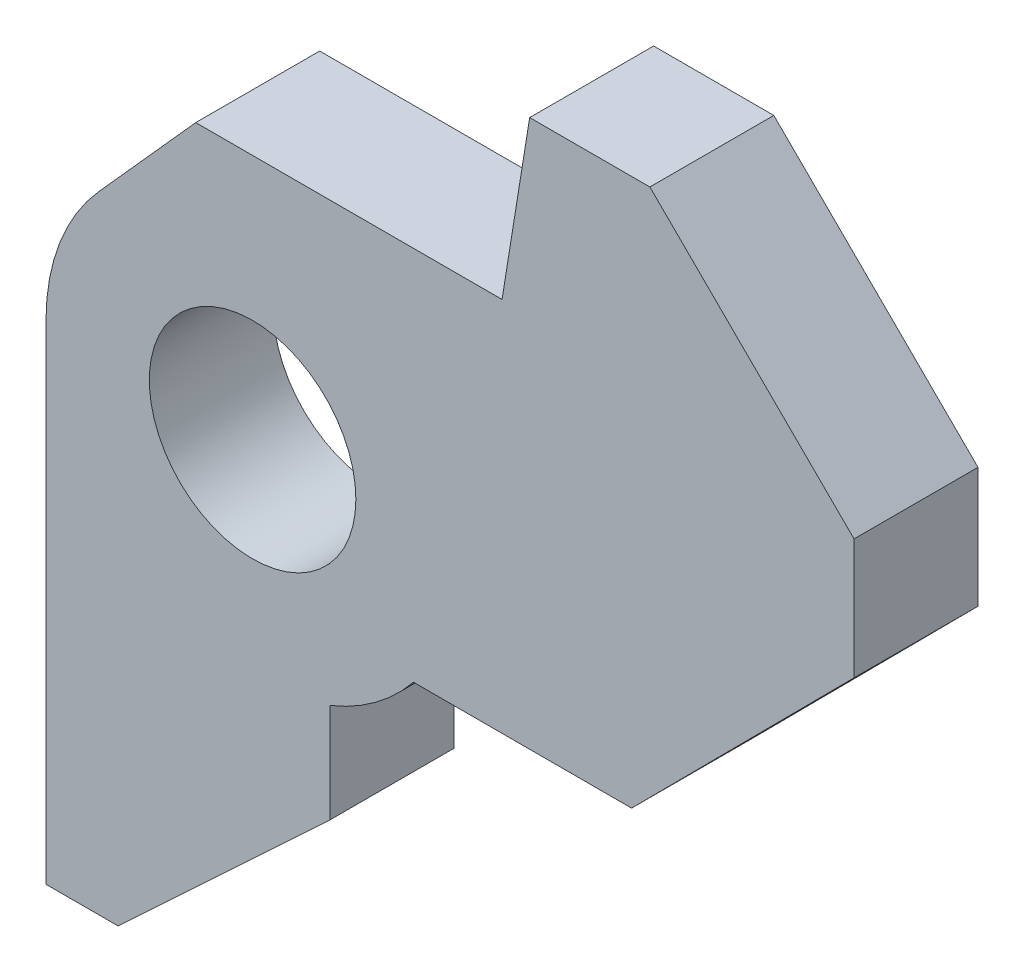
ISO-10303-21;
HEADER;
FILE_DESCRIPTION(('STEP AP214'),'2;1');
FILE_NAME('part.step','',(''),(''),'','','');
FILE_SCHEMA(('AUTOMOTIVE_DESIGN { 1 0 10303 214 1 1 1 1 }'));
ENDSEC;
DATA;
#1=APPLICATION_CONTEXT('core data for automotive mechanical design processes');
#2=APPLICATION_PROTOCOL_DEFINITION('international standard','automotive_design',2000,#1);
#3=PRODUCT_CONTEXT('',#1,'mechanical');
#4=PRODUCT('Part','Part','',(#3));
#5=PRODUCT_RELATED_PRODUCT_CATEGORY('part','',(#4));
#6=PRODUCT_DEFINITION_FORMATION('','',#4);
#7=PRODUCT_DEFINITION_CONTEXT('part definition',#1,'design');
#8=PRODUCT_DEFINITION('design','',#6,#7);
#9=PRODUCT_DEFINITION_SHAPE('','',#8);
#10=(LENGTH_UNIT() NAMED_UNIT(*) SI_UNIT(.MILLI.,.METRE.));
#11=(NAMED_UNIT(*) PLANE_ANGLE_UNIT() SI_UNIT($,.RADIAN.));
#12=(NAMED_UNIT(*) SI_UNIT($,.STERADIAN.) SOLID_ANGLE_UNIT());
#13=UNCERTAINTY_MEASURE_WITH_UNIT(LENGTH_MEASURE(1.E-05),#10,'distance_accuracy_value','');
#14=(GEOMETRIC_REPRESENTATION_CONTEXT(3) GLOBAL_UNCERTAINTY_ASSIGNED_CONTEXT((#13)) GLOBAL_UNIT_ASSIGNED_CONTEXT((#10,
#11,#12)) REPRESENTATION_CONTEXT('',''));
#15=CARTESIAN_POINT('',(0.,0.,0.));
#16=DIRECTION('',(0.,0.,1.));
#17=DIRECTION('',(1.,0.,0.));
#18=AXIS2_PLACEMENT_3D('',#15,#16,#17);
#19=CARTESIAN_POINT('',(-3.72439251199893,3.33600066195531,3.));
#20=DIRECTION('',(0.744878502399786,-0.667200132391063,0.));
#21=DIRECTION('',(0.667200132391063,0.744878502399786,0.));
#22=AXIS2_PLACEMENT_3D('',#19,#20,#21);
#23=PLANE('',#22);
#24=DIRECTION('',(-0.667200132391063,-0.744878502399786,0.));
#25=VECTOR('',#24,1.);
#26=CARTESIAN_POINT('',(-3.72439251199893,3.33600066195531,0.));
#27=LINE('',#26,#25);
#28=CARTESIAN_POINT('',(-1.37635566788677,5.95740626892641,0.));
#29=VERTEX_POINT('',#28);
#30=CARTESIAN_POINT('',(-3.72439251199893,3.33600066195531,0.));
#31=VERTEX_POINT('',#30);
#32=EDGE_CURVE('E170',#29,#31,#27,.T.);
#33=ORIENTED_EDGE('',*,*,#32,.T.);
#34=DIRECTION('',(0.,0.,-1.));
#35=VECTOR('',#34,1.);
#36=CARTESIAN_POINT('',(-3.72439251199893,3.33600066195531,3.));
#37=LINE('',#36,#35);
#38=CARTESIAN_POINT('',(-3.72439251199893,3.33600066195531,3.));
#39=VERTEX_POINT('',#38);
#40=EDGE_CURVE('E11',#39,#31,#37,.T.);
#41=ORIENTED_EDGE('',*,*,#40,.F.);
#42=DIRECTION('',(-0.667200132391063,-0.744878502399786,0.));
#43=VECTOR('',#42,1.);
#44=CARTESIAN_POINT('',(-3.72439251199893,3.33600066195531,3.));
#45=LINE('',#44,#43);
#46=CARTESIAN_POINT('',(-1.37635566788677,5.95740626892641,3.));
#47=VERTEX_POINT('',#46);
#48=EDGE_CURVE('E208',#47,#39,#45,.T.);
#49=ORIENTED_EDGE('',*,*,#48,.F.);
#50=DIRECTION('',(0.,0.,-1.));
#51=VECTOR('',#50,1.);
#52=CARTESIAN_POINT('',(-1.37635566788677,5.95740626892641,3.));
#53=LINE('',#52,#51);
#54=EDGE_CURVE('E169',#47,#29,#53,.T.);
#55=ORIENTED_EDGE('',*,*,#54,.T.);
#56=EDGE_LOOP('',(#33,#41,#49,#55));
#57=FACE_BOUND('',#56,.T.);
#58=ADVANCED_FACE('F35',(#57),#23,.F.);
#59=CARTESIAN_POINT('',(0.,0.,3.));
#60=DIRECTION('',(0.,0.,-1.));
#61=DIRECTION('',(-1.,0.,0.));
#62=AXIS2_PLACEMENT_3D('',#59,#60,#61);
#63=CYLINDRICAL_SURFACE('',#62,5.);
#64=CARTESIAN_POINT('',(0.,0.,0.));
#65=DIRECTION('',(0.,0.,1.));
#66=DIRECTION('',(1.,0.,0.));
#67=AXIS2_PLACEMENT_3D('',#64,#65,#66);
#68=CIRCLE('',#67,5.);
#69=CARTESIAN_POINT('',(-5.,0.,0.));
#70=VERTEX_POINT('',#69);
#71=EDGE_CURVE('E173',#31,#70,#68,.T.);
#72=ORIENTED_EDGE('',*,*,#71,.T.);
#73=DIRECTION('',(0.,0.,-1.));
#74=VECTOR('',#73,1.);
#75=CARTESIAN_POINT('',(-5.,0.,3.));
#76=LINE('',#75,#74);
#77=CARTESIAN_POINT('',(-5.,0.,3.));
#78=VERTEX_POINT('',#77);
#79=EDGE_CURVE('E43',#78,#70,#76,.T.);
#80=ORIENTED_EDGE('',*,*,#79,.F.);
#81=CARTESIAN_POINT('',(0.,0.,3.));
#82=DIRECTION('',(0.,0.,1.));
#83=DIRECTION('',(1.,0.,0.));
#84=AXIS2_PLACEMENT_3D('',#81,#82,#83);
#85=CIRCLE('',#84,5.);
#86=EDGE_CURVE('E108',#39,#78,#85,.T.);
#87=ORIENTED_EDGE('',*,*,#86,.F.);
#88=ORIENTED_EDGE('',*,*,#40,.T.);
#89=EDGE_LOOP('',(#72,#80,#87,#88));
#90=FACE_BOUND('',#89,.T.);
#91=ADVANCED_FACE('F233',(#90),#63,.T.);
#92=CARTESIAN_POINT('',(-5.,0.,3.));
#93=DIRECTION('',(-1.,0.,0.));
#94=DIRECTION('',(0.,-1.,0.));
#95=AXIS2_PLACEMENT_3D('',#92,#93,#94);
#96=PLANE('',#95);
#97=DIRECTION('',(0.,1.,0.));
#98=VECTOR('',#97,1.);
#99=CARTESIAN_POINT('',(-5.,0.,0.));
#100=LINE('',#99,#98);
#101=CARTESIAN_POINT('',(-5.,-11.8208712627164,0.));
#102=VERTEX_POINT('',#101);
#103=EDGE_CURVE('E176',#102,#70,#100,.T.);
#104=ORIENTED_EDGE('',*,*,#103,.F.);
#105=DIRECTION('',(0.,0.,-1.));
#106=VECTOR('',#105,1.);
#107=CARTESIAN_POINT('',(-5.,-11.8208712627164,3.));
#108=LINE('',#107,#106);
#109=CARTESIAN_POINT('',(-5.,-11.8208712627164,3.));
#110=VERTEX_POINT('',#109);
#111=EDGE_CURVE('E226',#110,#102,#108,.T.);
#112=ORIENTED_EDGE('',*,*,#111,.F.);
#113=DIRECTION('',(0.,1.,0.));
#114=VECTOR('',#113,1.);
#115=CARTESIAN_POINT('',(-5.,0.,3.));
#116=LINE('',#115,#114);
#117=EDGE_CURVE('E232',#110,#78,#116,.T.);
#118=ORIENTED_EDGE('',*,*,#117,.T.);
#119=ORIENTED_EDGE('',*,*,#79,.T.);
#120=EDGE_LOOP('',(#104,#112,#118,#119));
#121=FACE_BOUND('',#120,.T.);
#122=ADVANCED_FACE('F230',(#121),#96,.T.);
#123=CARTESIAN_POINT('',(0.,-11.8208712627164,3.));
#124=DIRECTION('',(0.,-1.,0.));
#125=DIRECTION('',(0.,0.,-1.));
#126=AXIS2_PLACEMENT_3D('',#123,#124,#125);
#127=PLANE('',#126);
#128=DIRECTION('',(-1.,0.,0.));
#129=VECTOR('',#128,1.);
#130=CARTESIAN_POINT('',(0.,-11.8208712627164,0.));
#131=LINE('',#130,#129);
#132=CARTESIAN_POINT('',(-3.25347983881159,-11.8208712627164,0.));
#133=VERTEX_POINT('',#132);
#134=EDGE_CURVE('E180',#133,#102,#131,.T.);
#135=ORIENTED_EDGE('',*,*,#134,.F.);
#136=DIRECTION('',(0.,0.,-1.));
#137=VECTOR('',#136,1.);
#138=CARTESIAN_POINT('',(-3.25347983881159,-11.8208712627164,3.));
#139=LINE('',#138,#137);
#140=CARTESIAN_POINT('',(-3.25347983881159,-11.8208712627164,3.));
#141=VERTEX_POINT('',#140);
#142=EDGE_CURVE('E224',#141,#133,#139,.T.);
#143=ORIENTED_EDGE('',*,*,#142,.F.);
#144=DIRECTION('',(-1.,0.,0.));
#145=VECTOR('',#144,1.);
#146=CARTESIAN_POINT('',(0.,-11.8208712627164,3.));
#147=LINE('',#146,#145);
#148=EDGE_CURVE('E246',#141,#110,#147,.T.);
#149=ORIENTED_EDGE('',*,*,#148,.T.);
#150=ORIENTED_EDGE('',*,*,#111,.T.);
#151=EDGE_LOOP('',(#135,#143,#149,#150));
#152=FACE_BOUND('',#151,.T.);
#153=ADVANCED_FACE('F242',(#152),#127,.T.);
#154=CARTESIAN_POINT('',(4.38123273818553,-4.69232370569134,3.));
#155=DIRECTION('',(-0.682462310143159,0.730920785881796,0.));
#156=DIRECTION('',(-0.730920785881796,-0.682462310143159,0.));
#157=AXIS2_PLACEMENT_3D('',#154,#155,#156);
#158=PLANE('',#157);
#159=DIRECTION('',(0.730920785881796,0.682462310143159,0.));
#160=VECTOR('',#159,1.);
#161=CARTESIAN_POINT('',(4.38123273818553,-4.69232370569134,0.));
#162=LINE('',#161,#160);
#163=CARTESIAN_POINT('',(1.87605445969652,-7.03141405348529,0.));
#164=VERTEX_POINT('',#163);
#165=EDGE_CURVE('E183',#133,#164,#162,.T.);
#166=ORIENTED_EDGE('',*,*,#165,.T.);
#167=DIRECTION('',(0.,0.,-1.));
#168=VECTOR('',#167,1.);
#169=CARTESIAN_POINT('',(1.87605445969652,-7.03141405348529,3.));
#170=LINE('',#169,#168);
#171=CARTESIAN_POINT('',(1.87605445969652,-7.03141405348529,3.));
#172=VERTEX_POINT('',#171);
#173=EDGE_CURVE('E222',#172,#164,#170,.T.);
#174=ORIENTED_EDGE('',*,*,#173,.F.);
#175=DIRECTION('',(0.730920785881796,0.682462310143159,0.));
#176=VECTOR('',#175,1.);
#177=CARTESIAN_POINT('',(4.38123273818553,-4.69232370569134,3.));
#178=LINE('',#177,#176);
#179=EDGE_CURVE('E248',#141,#172,#178,.T.);
#180=ORIENTED_EDGE('',*,*,#179,.F.);
#181=ORIENTED_EDGE('',*,*,#142,.T.);
#182=EDGE_LOOP('',(#166,#174,#180,#181));
#183=FACE_BOUND('',#182,.T.);
#184=ADVANCED_FACE('F304',(#183),#158,.F.);
#185=CARTESIAN_POINT('',(1.87605445969652,0.,3.));
#186=DIRECTION('',(1.,0.,0.));
#187=DIRECTION('',(0.,0.,-1.));
#188=AXIS2_PLACEMENT_3D('',#185,#186,#187);
#189=PLANE('',#188);
#190=DIRECTION('',(0.,-1.,0.));
#191=VECTOR('',#190,1.);
#192=CARTESIAN_POINT('',(1.87605445969652,0.,0.));
#193=LINE('',#192,#191);
#194=CARTESIAN_POINT('',(1.87605445969652,-4.63469736490451,0.));
#195=VERTEX_POINT('',#194);
#196=EDGE_CURVE('E186',#195,#164,#193,.T.);
#197=ORIENTED_EDGE('',*,*,#196,.F.);
#198=DIRECTION('',(0.,0.,-1.));
#199=VECTOR('',#198,1.);
#200=CARTESIAN_POINT('',(1.87605445969652,-4.63469736490451,3.));
#201=LINE('',#200,#199);
#202=CARTESIAN_POINT('',(1.87605445969652,-4.63469736490451,3.));
#203=VERTEX_POINT('',#202);
#204=EDGE_CURVE('E220',#203,#195,#201,.T.);
#205=ORIENTED_EDGE('',*,*,#204,.F.);
#206=DIRECTION('',(0.,-1.,0.));
#207=VECTOR('',#206,1.);
#208=CARTESIAN_POINT('',(1.87605445969652,0.,3.));
#209=LINE('',#208,#207);
#210=EDGE_CURVE('E255',#203,#172,#209,.T.);
#211=ORIENTED_EDGE('',*,*,#210,.T.);
#212=ORIENTED_EDGE('',*,*,#173,.T.);
#213=EDGE_LOOP('',(#197,#205,#211,#212));
#214=FACE_BOUND('',#213,.T.);
#215=ADVANCED_FACE('F296',(#214),#189,.T.);
#216=CARTESIAN_POINT('',(3.8931956076666,-3.13736003041498,0.));
#217=VERTEX_POINT('',#216);
#218=EDGE_CURVE('E177',#195,#217,#68,.T.);
#219=ORIENTED_EDGE('',*,*,#218,.T.);
#220=DIRECTION('',(0.,0.,-1.));
#221=VECTOR('',#220,1.);
#222=CARTESIAN_POINT('',(3.8931956076666,-3.13736003041498,3.));
#223=LINE('',#222,#221);
#224=CARTESIAN_POINT('',(3.8931956076666,-3.13736003041498,3.));
#225=VERTEX_POINT('',#224);
#226=EDGE_CURVE('E218',#225,#217,#223,.T.);
#227=ORIENTED_EDGE('',*,*,#226,.F.);
#228=EDGE_CURVE('E251',#203,#225,#85,.T.);
#229=ORIENTED_EDGE('',*,*,#228,.F.);
#230=ORIENTED_EDGE('',*,*,#204,.T.);
#231=EDGE_LOOP('',(#219,#227,#229,#230));
#232=FACE_BOUND('',#231,.T.);
#233=ADVANCED_FACE('F288',(#232),#63,.T.);
#234=CARTESIAN_POINT('',(0.,-3.13736003041498,3.));
#235=DIRECTION('',(0.,-1.,0.));
#236=DIRECTION('',(1.,0.,0.));
#237=AXIS2_PLACEMENT_3D('',#234,#235,#236);
#238=PLANE('',#237);
#239=DIRECTION('',(-1.,0.,0.));
#240=VECTOR('',#239,1.);
#241=CARTESIAN_POINT('',(0.,-3.13736003041498,0.));
#242=LINE('',#241,#240);
#243=CARTESIAN_POINT('',(9.17297865889068,-3.13736003041498,0.));
#244=VERTEX_POINT('',#243);
#245=EDGE_CURVE('E189',#244,#217,#242,.T.);
#246=ORIENTED_EDGE('',*,*,#245,.F.);
#247=DIRECTION('',(0.,0.,-1.));
#248=VECTOR('',#247,1.);
#249=CARTESIAN_POINT('',(9.17297865889068,-3.13736003041498,3.));
#250=LINE('',#249,#248);
#251=CARTESIAN_POINT('',(9.17297865889068,-3.13736003041498,3.));
#252=VERTEX_POINT('',#251);
#253=EDGE_CURVE('E216',#252,#244,#250,.T.);
#254=ORIENTED_EDGE('',*,*,#253,.F.);
#255=DIRECTION('',(-1.,0.,0.));
#256=VECTOR('',#255,1.);
#257=CARTESIAN_POINT('',(0.,-3.13736003041498,3.));
#258=LINE('',#257,#256);
#259=EDGE_CURVE('E258',#252,#225,#258,.T.);
#260=ORIENTED_EDGE('',*,*,#259,.T.);
#261=ORIENTED_EDGE('',*,*,#226,.T.);
#262=EDGE_LOOP('',(#246,#254,#260,#261));
#263=FACE_BOUND('',#262,.T.);
#264=ADVANCED_FACE('F295',(#263),#238,.T.);
#265=CARTESIAN_POINT('',(6.18871742745594,-6.14355777107952,3.));
#266=DIRECTION('',(0.709691382805681,-0.704512697665102,0.));
#267=DIRECTION('',(0.704512697665102,0.709691382805681,0.));
#268=AXIS2_PLACEMENT_3D('',#265,#266,#267);
#269=PLANE('',#268);
#270=DIRECTION('',(-0.704512697665102,-0.709691382805682,0.));
#271=VECTOR('',#270,1.);
#272=CARTESIAN_POINT('',(6.18871742745594,-6.14355777107952,0.));
#273=LINE('',#272,#271);
#274=CARTESIAN_POINT('',(14.557074242056,2.28631260492328,0.));
#275=VERTEX_POINT('',#274);
#276=EDGE_CURVE('E192',#275,#244,#273,.T.);
#277=ORIENTED_EDGE('',*,*,#276,.F.);
#278=DIRECTION('',(0.,0.,-1.));
#279=VECTOR('',#278,1.);
#280=CARTESIAN_POINT('',(14.557074242056,2.28631260492328,3.));
#281=LINE('',#280,#279);
#282=CARTESIAN_POINT('',(14.557074242056,2.28631260492328,3.));
#283=VERTEX_POINT('',#282);
#284=EDGE_CURVE('E214',#283,#275,#281,.T.);
#285=ORIENTED_EDGE('',*,*,#284,.F.);
#286=DIRECTION('',(-0.704512697665102,-0.709691382805682,0.));
#287=VECTOR('',#286,1.);
#288=CARTESIAN_POINT('',(6.18871742745594,-6.14355777107952,3.));
#289=LINE('',#288,#287);
#290=EDGE_CURVE('E261',#283,#252,#289,.T.);
#291=ORIENTED_EDGE('',*,*,#290,.T.);
#292=ORIENTED_EDGE('',*,*,#253,.T.);
#293=EDGE_LOOP('',(#277,#285,#291,#292));
#294=FACE_BOUND('',#293,.T.);
#295=ADVANCED_FACE('F302',(#294),#269,.T.);
#296=CARTESIAN_POINT('',(14.557074242056,0.,3.));
#297=DIRECTION('',(1.,0.,0.));
#298=DIRECTION('',(0.,0.,-1.));
#299=AXIS2_PLACEMENT_3D('',#296,#297,#298);
#300=PLANE('',#299);
#301=DIRECTION('',(0.,-1.,0.));
#302=VECTOR('',#301,1.);
#303=CARTESIAN_POINT('',(14.557074242056,0.,0.));
#304=LINE('',#303,#302);
#305=CARTESIAN_POINT('',(14.557074242056,5.19802237614641,0.));
#306=VERTEX_POINT('',#305);
#307=EDGE_CURVE('E195',#306,#275,#304,.T.);
#308=ORIENTED_EDGE('',*,*,#307,.F.);
#309=DIRECTION('',(0.,0.,-1.));
#310=VECTOR('',#309,1.);
#311=CARTESIAN_POINT('',(14.557074242056,5.19802237614641,3.));
#312=LINE('',#311,#310);
#313=CARTESIAN_POINT('',(14.557074242056,5.19802237614641,3.));
#314=VERTEX_POINT('',#313);
#315=EDGE_CURVE('E212',#314,#306,#312,.T.);
#316=ORIENTED_EDGE('',*,*,#315,.F.);
#317=DIRECTION('',(0.,-1.,0.));
#318=VECTOR('',#317,1.);
#319=CARTESIAN_POINT('',(14.557074242056,0.,3.));
#320=LINE('',#319,#318);
#321=EDGE_CURVE('E264',#314,#283,#320,.T.);
#322=ORIENTED_EDGE('',*,*,#321,.T.);
#323=ORIENTED_EDGE('',*,*,#284,.T.);
#324=EDGE_LOOP('',(#308,#316,#322,#323));
#325=FACE_BOUND('',#324,.T.);
#326=ADVANCED_FACE('F318',(#325),#300,.T.);
#327=CARTESIAN_POINT('',(9.82417265596004,9.89638753174656,3.));
#328=DIRECTION('',(0.704512697665102,0.709691382805682,0.));
#329=DIRECTION('',(-0.709691382805682,0.704512697665102,0.));
#330=AXIS2_PLACEMENT_3D('',#327,#328,#329);
#331=PLANE('',#330);
#332=DIRECTION('',(0.709691382805682,-0.704512697665102,0.));
#333=VECTOR('',#332,1.);
#334=CARTESIAN_POINT('',(9.82417265596004,9.89638753174656,0.));
#335=LINE('',#334,#333);
#336=CARTESIAN_POINT('',(9.61535339808183,10.1036830157506,0.));
#337=VERTEX_POINT('',#336);
#338=EDGE_CURVE('E198',#337,#306,#335,.T.);
#339=ORIENTED_EDGE('',*,*,#338,.F.);
#340=DIRECTION('',(0.,0.,-1.));
#341=VECTOR('',#340,1.);
#342=CARTESIAN_POINT('',(9.61535339808183,10.1036830157506,3.));
#343=LINE('',#342,#341);
#344=CARTESIAN_POINT('',(9.61535339808183,10.1036830157506,3.));
#345=VERTEX_POINT('',#344);
#346=EDGE_CURVE('E151',#345,#337,#343,.T.);
#347=ORIENTED_EDGE('',*,*,#346,.F.);
#348=DIRECTION('',(0.709691382805682,-0.704512697665102,0.));
#349=VECTOR('',#348,1.);
#350=CARTESIAN_POINT('',(9.82417265596004,9.89638753174656,3.));
#351=LINE('',#350,#349);
#352=EDGE_CURVE('E159',#345,#314,#351,.T.);
#353=ORIENTED_EDGE('',*,*,#352,.T.);
#354=ORIENTED_EDGE('',*,*,#315,.T.);
#355=EDGE_LOOP('',(#339,#347,#353,#354));
#356=FACE_BOUND('',#355,.T.);
#357=ADVANCED_FACE('F268',(#356),#331,.T.);
#358=CARTESIAN_POINT('',(0.,10.1036830157506,3.));
#359=DIRECTION('',(0.,1.,0.));
#360=DIRECTION('',(0.,0.,1.));
#361=AXIS2_PLACEMENT_3D('',#358,#359,#360);
#362=PLANE('',#361);
#363=DIRECTION('',(1.,0.,0.));
#364=VECTOR('',#363,1.);
#365=CARTESIAN_POINT('',(0.,10.1036830157506,0.));
#366=LINE('',#365,#364);
#367=CARTESIAN_POINT('',(6.70626849442613,10.1036830157506,0.));
#368=VERTEX_POINT('',#367);
#369=EDGE_CURVE('E146',#368,#337,#366,.T.);
#370=ORIENTED_EDGE('',*,*,#369,.F.);
#371=DIRECTION('',(0.,0.,-1.));
#372=VECTOR('',#371,1.);
#373=CARTESIAN_POINT('',(6.70626849442613,10.1036830157506,3.));
#374=LINE('',#373,#372);
#375=CARTESIAN_POINT('',(6.70626849442613,10.1036830157506,3.));
#376=VERTEX_POINT('',#375);
#377=EDGE_CURVE('E141',#376,#368,#374,.T.);
#378=ORIENTED_EDGE('',*,*,#377,.F.);
#379=DIRECTION('',(1.,0.,0.));
#380=VECTOR('',#379,1.);
#381=CARTESIAN_POINT('',(0.,10.1036830157506,3.));
#382=LINE('',#381,#380);
#383=EDGE_CURVE('E144',#376,#345,#382,.T.);
#384=ORIENTED_EDGE('',*,*,#383,.T.);
#385=ORIENTED_EDGE('',*,*,#346,.T.);
#386=EDGE_LOOP('',(#370,#378,#384,#385));
#387=FACE_BOUND('',#386,.T.);
#388=ADVANCED_FACE('F143',(#387),#362,.T.);
#389=CARTESIAN_POINT('',(4.94893615583577,-0.797776271857066,3.));
#390=DIRECTION('',(-0.987254891374429,0.159147037224273,0.));
#391=DIRECTION('',(-0.159147037224273,-0.987254891374429,0.));
#392=AXIS2_PLACEMENT_3D('',#389,#390,#391);
#393=PLANE('',#392);
#394=DIRECTION('',(0.159147037224273,0.987254891374429,0.));
#395=VECTOR('',#394,1.);
#396=CARTESIAN_POINT('',(4.94893615583577,-0.797776271857066,0.));
#397=LINE('',#396,#395);
#398=CARTESIAN_POINT('',(6.03788217845628,5.95740626892641,0.));
#399=VERTEX_POINT('',#398);
#400=EDGE_CURVE('E202',#399,#368,#397,.T.);
#401=ORIENTED_EDGE('',*,*,#400,.F.);
#402=DIRECTION('',(0.,0.,-1.));
#403=VECTOR('',#402,1.);
#404=CARTESIAN_POINT('',(6.03788217845628,5.95740626892641,3.));
#405=LINE('',#404,#403);
#406=CARTESIAN_POINT('',(6.03788217845628,5.95740626892641,3.));
#407=VERTEX_POINT('',#406);
#408=EDGE_CURVE('E97',#407,#399,#405,.T.);
#409=ORIENTED_EDGE('',*,*,#408,.F.);
#410=DIRECTION('',(0.159147037224273,0.987254891374429,0.));
#411=VECTOR('',#410,1.);
#412=CARTESIAN_POINT('',(4.94893615583577,-0.797776271857066,3.));
#413=LINE('',#412,#411);
#414=EDGE_CURVE('E156',#407,#376,#413,.T.);
#415=ORIENTED_EDGE('',*,*,#414,.T.);
#416=ORIENTED_EDGE('',*,*,#377,.T.);
#417=EDGE_LOOP('',(#401,#409,#415,#416));
#418=FACE_BOUND('',#417,.T.);
#419=ADVANCED_FACE('F161',(#418),#393,.T.);
#420=CARTESIAN_POINT('',(0.,5.95740626892641,3.));
#421=DIRECTION('',(0.,-1.,0.));
#422=DIRECTION('',(1.,0.,0.));
#423=AXIS2_PLACEMENT_3D('',#420,#421,#422);
#424=PLANE('',#423);
#425=DIRECTION('',(-1.,0.,0.));
#426=VECTOR('',#425,1.);
#427=CARTESIAN_POINT('',(0.,5.95740626892641,0.));
#428=LINE('',#427,#426);
#429=EDGE_CURVE('E100',#399,#29,#428,.T.);
#430=ORIENTED_EDGE('',*,*,#429,.T.);
#431=ORIENTED_EDGE('',*,*,#54,.F.);
#432=DIRECTION('',(-1.,0.,0.));
#433=VECTOR('',#432,1.);
#434=CARTESIAN_POINT('',(0.,5.95740626892641,3.));
#435=LINE('',#434,#433);
#436=EDGE_CURVE('E51',#407,#47,#435,.T.);
#437=ORIENTED_EDGE('',*,*,#436,.F.);
#438=ORIENTED_EDGE('',*,*,#408,.T.);
#439=EDGE_LOOP('',(#430,#431,#437,#438));
#440=FACE_BOUND('',#439,.T.);
#441=ADVANCED_FACE('F272',(#440),#424,.F.);
#442=CARTESIAN_POINT('',(0.,0.,3.));
#443=DIRECTION('',(0.,0.,-1.));
#444=DIRECTION('',(-1.,0.,0.));
#445=AXIS2_PLACEMENT_3D('',#442,#443,#444);
#446=CYLINDRICAL_SURFACE('',#445,2.5);
#447=CARTESIAN_POINT('',(0.,0.,3.));
#448=DIRECTION('',(0.,0.,1.));
#449=DIRECTION('',(1.,0.,0.));
#450=AXIS2_PLACEMENT_3D('',#447,#448,#449);
#451=CIRCLE('',#450,2.5);
#452=CARTESIAN_POINT('',(2.5,0.,3.));
#453=VERTEX_POINT('',#452);
#454=EDGE_CURVE('E163',#453,#453,#451,.T.);
#455=ORIENTED_EDGE('',*,*,#454,.T.);
#456=EDGE_LOOP('',(#455));
#457=FACE_BOUND('',#456,.T.);
#458=CARTESIAN_POINT('',(0.,0.,0.));
#459=DIRECTION('',(0.,0.,1.));
#460=DIRECTION('',(1.,0.,0.));
#461=AXIS2_PLACEMENT_3D('',#458,#459,#460);
#462=CIRCLE('',#461,2.5);
#463=CARTESIAN_POINT('',(2.5,0.,0.));
#464=VERTEX_POINT('',#463);
#465=EDGE_CURVE('E205',#464,#464,#462,.T.);
#466=ORIENTED_EDGE('',*,*,#465,.F.);
#467=EDGE_LOOP('',(#466));
#468=FACE_BOUND('',#467,.T.);
#469=ADVANCED_FACE('F274',(#457,#468),#446,.F.);
#470=CARTESIAN_POINT('',(0.,0.,3.));
#471=DIRECTION('',(0.,0.,1.));
#472=DIRECTION('',(1.,0.,0.));
#473=AXIS2_PLACEMENT_3D('',#470,#471,#472);
#474=PLANE('',#473);
#475=ORIENTED_EDGE('',*,*,#48,.T.);
#476=ORIENTED_EDGE('',*,*,#86,.T.);
#477=ORIENTED_EDGE('',*,*,#117,.F.);
#478=ORIENTED_EDGE('',*,*,#148,.F.);
#479=ORIENTED_EDGE('',*,*,#179,.T.);
#480=ORIENTED_EDGE('',*,*,#210,.F.);
#481=ORIENTED_EDGE('',*,*,#228,.T.);
#482=ORIENTED_EDGE('',*,*,#259,.F.);
#483=ORIENTED_EDGE('',*,*,#290,.F.);
#484=ORIENTED_EDGE('',*,*,#321,.F.);
#485=ORIENTED_EDGE('',*,*,#352,.F.);
#486=ORIENTED_EDGE('',*,*,#383,.F.);
#487=ORIENTED_EDGE('',*,*,#414,.F.);
#488=ORIENTED_EDGE('',*,*,#436,.T.);
#489=EDGE_LOOP('',(#475,#476,#477,#478,#479,#480,#481,#482,#483,#484,#485,#486,#487,#488));
#490=FACE_BOUND('',#489,.T.);
#491=ORIENTED_EDGE('',*,*,#454,.F.);
#492=EDGE_LOOP('',(#491));
#493=FACE_BOUND('',#492,.T.);
#494=ADVANCED_FACE('F154',(#490,#493),#474,.T.);
#495=CARTESIAN_POINT('',(0.,0.,0.));
#496=DIRECTION('',(0.,0.,1.));
#497=DIRECTION('',(1.,0.,0.));
#498=AXIS2_PLACEMENT_3D('',#495,#496,#497);
#499=PLANE('',#498);
#500=ORIENTED_EDGE('',*,*,#32,.F.);
#501=ORIENTED_EDGE('',*,*,#429,.F.);
#502=ORIENTED_EDGE('',*,*,#400,.T.);
#503=ORIENTED_EDGE('',*,*,#369,.T.);
#504=ORIENTED_EDGE('',*,*,#338,.T.);
#505=ORIENTED_EDGE('',*,*,#307,.T.);
#506=ORIENTED_EDGE('',*,*,#276,.T.);
#507=ORIENTED_EDGE('',*,*,#245,.T.);
#508=ORIENTED_EDGE('',*,*,#218,.F.);
#509=ORIENTED_EDGE('',*,*,#196,.T.);
#510=ORIENTED_EDGE('',*,*,#165,.F.);
#511=ORIENTED_EDGE('',*,*,#134,.T.);
#512=ORIENTED_EDGE('',*,*,#103,.T.);
#513=ORIENTED_EDGE('',*,*,#71,.F.);
#514=EDGE_LOOP('',(#500,#501,#502,#503,#504,#505,#506,#507,#508,#509,#510,#511,#512,#513));
#515=FACE_BOUND('',#514,.T.);
#516=ORIENTED_EDGE('',*,*,#465,.T.);
#517=EDGE_LOOP('',(#516));
#518=FACE_BOUND('',#517,.T.);
#519=ADVANCED_FACE('F237',(#515,#518),#499,.F.);
#520=CLOSED_SHELL('',(#58,#91,#122,#153,#184,#215,#233,#264,#295,#326,#357,#388,#419,#441,#469,
#494,#519));
#521=MANIFOLD_SOLID_BREP('B2',#520);
#522=ADVANCED_BREP_SHAPE_REPRESENTATION('',(#18,#521),#14);
#523=SHAPE_DEFINITION_REPRESENTATION(#9,#522);
ENDSEC;
END-ISO-10303-21;
